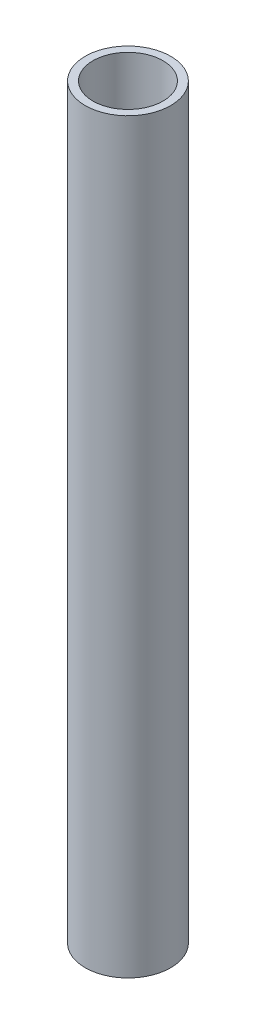
ISO-10303-21;
HEADER;
FILE_DESCRIPTION(('STEP AP214'),'2;1');
FILE_NAME('part.step','',(''),(''),'','','');
FILE_SCHEMA(('AUTOMOTIVE_DESIGN { 1 0 10303 214 1 1 1 1 }'));
ENDSEC;
DATA;
#1=APPLICATION_CONTEXT('core data for automotive mechanical design processes');
#2=APPLICATION_PROTOCOL_DEFINITION('international standard','automotive_design',2000,#1);
#3=PRODUCT_CONTEXT('',#1,'mechanical');
#4=PRODUCT('Part','Part','',(#3));
#5=PRODUCT_RELATED_PRODUCT_CATEGORY('part','',(#4));
#6=PRODUCT_DEFINITION_FORMATION('','',#4);
#7=PRODUCT_DEFINITION_CONTEXT('part definition',#1,'design');
#8=PRODUCT_DEFINITION('design','',#6,#7);
#9=PRODUCT_DEFINITION_SHAPE('','',#8);
#10=(LENGTH_UNIT() NAMED_UNIT(*) SI_UNIT(.MILLI.,.METRE.));
#11=(NAMED_UNIT(*) PLANE_ANGLE_UNIT() SI_UNIT($,.RADIAN.));
#12=(NAMED_UNIT(*) SI_UNIT($,.STERADIAN.) SOLID_ANGLE_UNIT());
#13=UNCERTAINTY_MEASURE_WITH_UNIT(LENGTH_MEASURE(1.E-05),#10,'distance_accuracy_value','');
#14=(GEOMETRIC_REPRESENTATION_CONTEXT(3) GLOBAL_UNCERTAINTY_ASSIGNED_CONTEXT((#13)) GLOBAL_UNIT_ASSIGNED_CONTEXT((#10,
#11,#12)) REPRESENTATION_CONTEXT('',''));
#15=CARTESIAN_POINT('',(0.,0.,0.));
#16=DIRECTION('',(0.,0.,1.));
#17=DIRECTION('',(1.,0.,0.));
#18=AXIS2_PLACEMENT_3D('',#15,#16,#17);
#19=CARTESIAN_POINT('',(0.,368.3,0.));
#20=DIRECTION('',(0.,1.,0.));
#21=DIRECTION('',(0.,0.,1.));
#22=AXIS2_PLACEMENT_3D('',#19,#20,#21);
#23=CYLINDRICAL_SURFACE('',#22,17.272);
#24=CARTESIAN_POINT('',(0.,368.3,0.));
#25=DIRECTION('',(0.,1.,0.));
#26=DIRECTION('',(0.,0.,1.));
#27=AXIS2_PLACEMENT_3D('',#24,#25,#26);
#28=CIRCLE('',#27,17.272);
#29=CARTESIAN_POINT('',(0.,368.3,17.272));
#30=VERTEX_POINT('',#29);
#31=EDGE_CURVE('E27',#30,#30,#28,.F.);
#32=ORIENTED_EDGE('',*,*,#31,.F.);
#33=EDGE_LOOP('',(#32));
#34=FACE_BOUND('',#33,.T.);
#35=CARTESIAN_POINT('',(0.,0.,0.));
#36=DIRECTION('',(0.,1.,0.));
#37=DIRECTION('',(0.,0.,1.));
#38=AXIS2_PLACEMENT_3D('',#35,#36,#37);
#39=CIRCLE('',#38,17.272);
#40=CARTESIAN_POINT('',(0.,0.,17.272));
#41=VERTEX_POINT('',#40);
#42=EDGE_CURVE('E18',#41,#41,#39,.F.);
#43=ORIENTED_EDGE('',*,*,#42,.T.);
#44=EDGE_LOOP('',(#43));
#45=FACE_BOUND('',#44,.T.);
#46=ADVANCED_FACE('F15',(#34,#45),#23,.F.);
#47=CARTESIAN_POINT('',(0.,0.,0.));
#48=DIRECTION('',(0.,1.,0.));
#49=DIRECTION('',(0.,0.,1.));
#50=AXIS2_PLACEMENT_3D('',#47,#48,#49);
#51=PLANE('',#50);
#52=ORIENTED_EDGE('',*,*,#42,.F.);
#53=EDGE_LOOP('',(#52));
#54=FACE_BOUND('',#53,.T.);
#55=CARTESIAN_POINT('',(0.,0.,0.));
#56=DIRECTION('',(0.,1.,0.));
#57=DIRECTION('',(0.,0.,1.));
#58=AXIS2_PLACEMENT_3D('',#55,#56,#57);
#59=CIRCLE('',#58,21.082);
#60=CARTESIAN_POINT('',(0.,0.,21.082));
#61=VERTEX_POINT('',#60);
#62=EDGE_CURVE('E22',#61,#61,#59,.T.);
#63=ORIENTED_EDGE('',*,*,#62,.F.);
#64=EDGE_LOOP('',(#63));
#65=FACE_BOUND('',#64,.T.);
#66=ADVANCED_FACE('F36',(#54,#65),#51,.F.);
#67=CARTESIAN_POINT('',(0.,368.3,0.));
#68=DIRECTION('',(0.,1.,0.));
#69=DIRECTION('',(0.,0.,1.));
#70=AXIS2_PLACEMENT_3D('',#67,#68,#69);
#71=PLANE('',#70);
#72=ORIENTED_EDGE('',*,*,#31,.T.);
#73=EDGE_LOOP('',(#72));
#74=FACE_BOUND('',#73,.T.);
#75=CARTESIAN_POINT('',(0.,368.3,0.));
#76=DIRECTION('',(0.,1.,0.));
#77=DIRECTION('',(0.,0.,1.));
#78=AXIS2_PLACEMENT_3D('',#75,#76,#77);
#79=CIRCLE('',#78,21.082);
#80=CARTESIAN_POINT('',(0.,368.3,21.082));
#81=VERTEX_POINT('',#80);
#82=EDGE_CURVE('E10',#81,#81,#79,.F.);
#83=ORIENTED_EDGE('',*,*,#82,.F.);
#84=EDGE_LOOP('',(#83));
#85=FACE_BOUND('',#84,.T.);
#86=ADVANCED_FACE('F39',(#74,#85),#71,.T.);
#87=CARTESIAN_POINT('',(0.,0.,0.));
#88=DIRECTION('',(0.,1.,0.));
#89=DIRECTION('',(0.,0.,1.));
#90=AXIS2_PLACEMENT_3D('',#87,#88,#89);
#91=CYLINDRICAL_SURFACE('',#90,21.082);
#92=ORIENTED_EDGE('',*,*,#82,.T.);
#93=EDGE_LOOP('',(#92));
#94=FACE_BOUND('',#93,.T.);
#95=ORIENTED_EDGE('',*,*,#62,.T.);
#96=EDGE_LOOP('',(#95));
#97=FACE_BOUND('',#96,.T.);
#98=ADVANCED_FACE('F42',(#94,#97),#91,.T.);
#99=CLOSED_SHELL('',(#46,#66,#86,#98));
#100=MANIFOLD_SOLID_BREP('B1',#99);
#101=ADVANCED_BREP_SHAPE_REPRESENTATION('',(#18,#100),#14);
#102=SHAPE_DEFINITION_REPRESENTATION(#9,#101);
ENDSEC;
END-ISO-10303-21;
